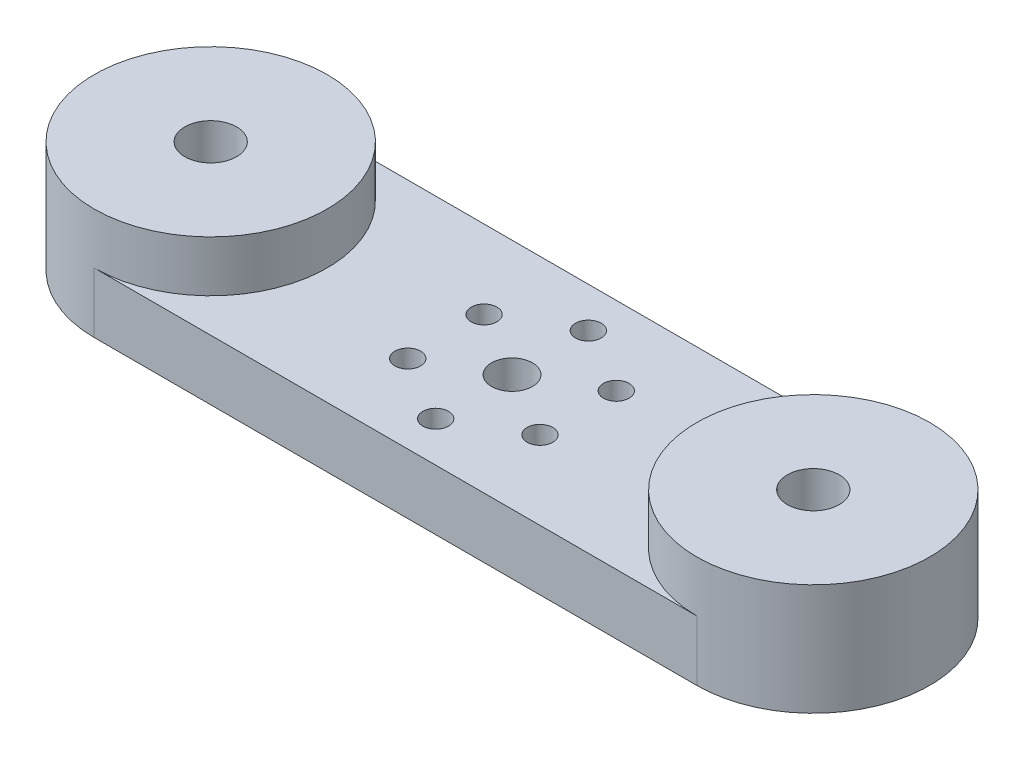
ISO-10303-21;
HEADER;
FILE_DESCRIPTION(('STEP AP214'),'2;1');
FILE_NAME('part.step','',(''),(''),'','','');
FILE_SCHEMA(('AUTOMOTIVE_DESIGN { 1 0 10303 214 1 1 1 1 }'));
ENDSEC;
DATA;
#1=APPLICATION_CONTEXT('core data for automotive mechanical design processes');
#2=APPLICATION_PROTOCOL_DEFINITION('international standard','automotive_design',2000,#1);
#3=PRODUCT_CONTEXT('',#1,'mechanical');
#4=PRODUCT('Part','Part','',(#3));
#5=PRODUCT_RELATED_PRODUCT_CATEGORY('part','',(#4));
#6=PRODUCT_DEFINITION_FORMATION('','',#4);
#7=PRODUCT_DEFINITION_CONTEXT('part definition',#1,'design');
#8=PRODUCT_DEFINITION('design','',#6,#7);
#9=PRODUCT_DEFINITION_SHAPE('','',#8);
#10=(LENGTH_UNIT() NAMED_UNIT(*) SI_UNIT(.MILLI.,.METRE.));
#11=(NAMED_UNIT(*) PLANE_ANGLE_UNIT() SI_UNIT($,.RADIAN.));
#12=(NAMED_UNIT(*) SI_UNIT($,.STERADIAN.) SOLID_ANGLE_UNIT());
#13=UNCERTAINTY_MEASURE_WITH_UNIT(LENGTH_MEASURE(1.E-05),#10,'distance_accuracy_value','');
#14=(GEOMETRIC_REPRESENTATION_CONTEXT(3) GLOBAL_UNCERTAINTY_ASSIGNED_CONTEXT((#13)) GLOBAL_UNIT_ASSIGNED_CONTEXT((#10,
#11,#12)) REPRESENTATION_CONTEXT('',''));
#15=CARTESIAN_POINT('',(0.,0.,0.));
#16=DIRECTION('',(0.,0.,1.));
#17=DIRECTION('',(1.,0.,0.));
#18=AXIS2_PLACEMENT_3D('',#15,#16,#17);
#19=CARTESIAN_POINT('',(-37.5,-7.5,0.));
#20=DIRECTION('',(0.,1.,0.));
#21=DIRECTION('',(0.,0.,1.));
#22=AXIS2_PLACEMENT_3D('',#19,#20,#21);
#23=CYLINDRICAL_SURFACE('',#22,14.5);
#24=DIRECTION('',(0.,1.,0.));
#25=VECTOR('',#24,1.);
#26=CARTESIAN_POINT('',(-37.5,-7.5,14.5));
#27=LINE('',#26,#25);
#28=CARTESIAN_POINT('',(-37.5,-7.5,14.5));
#29=VERTEX_POINT('',#28);
#30=CARTESIAN_POINT('',(-37.5,0.,14.5));
#31=VERTEX_POINT('',#30);
#32=EDGE_CURVE('E92',#29,#31,#27,.T.);
#33=ORIENTED_EDGE('',*,*,#32,.T.);
#34=CARTESIAN_POINT('',(-37.5,0.,0.));
#35=DIRECTION('',(0.,1.,0.));
#36=DIRECTION('',(0.,0.,1.));
#37=AXIS2_PLACEMENT_3D('',#34,#35,#36);
#38=CIRCLE('',#37,14.5);
#39=CARTESIAN_POINT('',(-37.5,0.,-14.5));
#40=VERTEX_POINT('',#39);
#41=EDGE_CURVE('E67',#31,#40,#38,.T.);
#42=ORIENTED_EDGE('',*,*,#41,.T.);
#43=DIRECTION('',(0.,1.,0.));
#44=VECTOR('',#43,1.);
#45=CARTESIAN_POINT('',(-37.5,-7.5,-14.5));
#46=LINE('',#45,#44);
#47=CARTESIAN_POINT('',(-37.5,-7.5,-14.5));
#48=VERTEX_POINT('',#47);
#49=EDGE_CURVE('E55',#48,#40,#46,.T.);
#50=ORIENTED_EDGE('',*,*,#49,.F.);
#51=CARTESIAN_POINT('',(-37.5,-7.5,0.));
#52=DIRECTION('',(0.,1.,0.));
#53=DIRECTION('',(0.,0.,1.));
#54=AXIS2_PLACEMENT_3D('',#51,#52,#53);
#55=CIRCLE('',#54,14.5);
#56=EDGE_CURVE('E104',#48,#29,#55,.T.);
#57=ORIENTED_EDGE('',*,*,#56,.T.);
#58=EDGE_LOOP('',(#33,#42,#50,#57));
#59=FACE_BOUND('',#58,.T.);
#60=CARTESIAN_POINT('',(-37.5,6.35,0.));
#61=DIRECTION('',(0.,1.,0.));
#62=DIRECTION('',(0.,0.,1.));
#63=AXIS2_PLACEMENT_3D('',#60,#61,#62);
#64=CIRCLE('',#63,14.5);
#65=CARTESIAN_POINT('',(-37.5,6.35,14.5));
#66=VERTEX_POINT('',#65);
#67=EDGE_CURVE('E135',#66,#66,#64,.T.);
#68=ORIENTED_EDGE('',*,*,#67,.F.);
#69=EDGE_LOOP('',(#68));
#70=FACE_BOUND('',#69,.T.);
#71=ADVANCED_FACE('F39',(#59,#70),#23,.T.);
#72=CARTESIAN_POINT('',(0.,-7.5,-14.5));
#73=DIRECTION('',(0.,0.,1.));
#74=DIRECTION('',(1.,0.,0.));
#75=AXIS2_PLACEMENT_3D('',#72,#73,#74);
#76=PLANE('',#75);
#77=DIRECTION('',(1.,0.,0.));
#78=VECTOR('',#77,1.);
#79=CARTESIAN_POINT('',(0.,0.,-14.5));
#80=LINE('',#79,#78);
#81=CARTESIAN_POINT('',(37.5,0.,-14.5));
#82=VERTEX_POINT('',#81);
#83=EDGE_CURVE('E115',#40,#82,#80,.T.);
#84=ORIENTED_EDGE('',*,*,#83,.T.);
#85=DIRECTION('',(0.,1.,0.));
#86=VECTOR('',#85,1.);
#87=CARTESIAN_POINT('',(37.5,-7.5,-14.5));
#88=LINE('',#87,#86);
#89=CARTESIAN_POINT('',(37.5,-7.5,-14.5));
#90=VERTEX_POINT('',#89);
#91=EDGE_CURVE('E91',#90,#82,#88,.T.);
#92=ORIENTED_EDGE('',*,*,#91,.F.);
#93=DIRECTION('',(1.,0.,0.));
#94=VECTOR('',#93,1.);
#95=CARTESIAN_POINT('',(0.,-7.5,-14.5));
#96=LINE('',#95,#94);
#97=EDGE_CURVE('E100',#48,#90,#96,.T.);
#98=ORIENTED_EDGE('',*,*,#97,.F.);
#99=ORIENTED_EDGE('',*,*,#49,.T.);
#100=EDGE_LOOP('',(#84,#92,#98,#99));
#101=FACE_BOUND('',#100,.T.);
#102=ADVANCED_FACE('F127',(#101),#76,.F.);
#103=CARTESIAN_POINT('',(37.5,-7.5,0.));
#104=DIRECTION('',(0.,1.,0.));
#105=DIRECTION('',(0.,0.,1.));
#106=AXIS2_PLACEMENT_3D('',#103,#104,#105);
#107=CYLINDRICAL_SURFACE('',#106,14.5);
#108=ORIENTED_EDGE('',*,*,#91,.T.);
#109=CARTESIAN_POINT('',(37.5,0.,0.));
#110=DIRECTION('',(0.,1.,0.));
#111=DIRECTION('',(0.,0.,1.));
#112=AXIS2_PLACEMENT_3D('',#109,#110,#111);
#113=CIRCLE('',#112,14.5);
#114=CARTESIAN_POINT('',(37.5,0.,14.5));
#115=VERTEX_POINT('',#114);
#116=EDGE_CURVE('E47',#82,#115,#113,.T.);
#117=ORIENTED_EDGE('',*,*,#116,.T.);
#118=DIRECTION('',(0.,1.,0.));
#119=VECTOR('',#118,1.);
#120=CARTESIAN_POINT('',(37.5,-7.5,14.5));
#121=LINE('',#120,#119);
#122=CARTESIAN_POINT('',(37.5,-7.5,14.5));
#123=VERTEX_POINT('',#122);
#124=EDGE_CURVE('E83',#123,#115,#121,.T.);
#125=ORIENTED_EDGE('',*,*,#124,.F.);
#126=CARTESIAN_POINT('',(37.5,-7.5,0.));
#127=DIRECTION('',(0.,1.,0.));
#128=DIRECTION('',(0.,0.,1.));
#129=AXIS2_PLACEMENT_3D('',#126,#127,#128);
#130=CIRCLE('',#129,14.5);
#131=EDGE_CURVE('E88',#123,#90,#130,.T.);
#132=ORIENTED_EDGE('',*,*,#131,.T.);
#133=EDGE_LOOP('',(#108,#117,#125,#132));
#134=FACE_BOUND('',#133,.T.);
#135=CARTESIAN_POINT('',(37.5,6.35,0.));
#136=DIRECTION('',(0.,1.,0.));
#137=DIRECTION('',(0.,0.,1.));
#138=AXIS2_PLACEMENT_3D('',#135,#136,#137);
#139=CIRCLE('',#138,14.5);
#140=CARTESIAN_POINT('',(37.5,6.35,14.5));
#141=VERTEX_POINT('',#140);
#142=EDGE_CURVE('E116',#141,#141,#139,.T.);
#143=ORIENTED_EDGE('',*,*,#142,.F.);
#144=EDGE_LOOP('',(#143));
#145=FACE_BOUND('',#144,.T.);
#146=ADVANCED_FACE('F86',(#134,#145),#107,.T.);
#147=CARTESIAN_POINT('',(0.,-7.5,14.5));
#148=DIRECTION('',(0.,0.,1.));
#149=DIRECTION('',(1.,0.,0.));
#150=AXIS2_PLACEMENT_3D('',#147,#148,#149);
#151=PLANE('',#150);
#152=DIRECTION('',(1.,0.,0.));
#153=VECTOR('',#152,1.);
#154=CARTESIAN_POINT('',(0.,0.,14.5));
#155=LINE('',#154,#153);
#156=EDGE_CURVE('E74',#31,#115,#155,.T.);
#157=ORIENTED_EDGE('',*,*,#156,.F.);
#158=ORIENTED_EDGE('',*,*,#32,.F.);
#159=DIRECTION('',(1.,0.,0.));
#160=VECTOR('',#159,1.);
#161=CARTESIAN_POINT('',(0.,-7.5,14.5));
#162=LINE('',#161,#160);
#163=EDGE_CURVE('E99',#29,#123,#162,.T.);
#164=ORIENTED_EDGE('',*,*,#163,.T.);
#165=ORIENTED_EDGE('',*,*,#124,.T.);
#166=EDGE_LOOP('',(#157,#158,#164,#165));
#167=FACE_BOUND('',#166,.T.);
#168=ADVANCED_FACE('F103',(#167),#151,.T.);
#169=CARTESIAN_POINT('',(0.,-7.5,0.));
#170=DIRECTION('',(0.,1.,0.));
#171=DIRECTION('',(0.,0.,1.));
#172=AXIS2_PLACEMENT_3D('',#169,#170,#171);
#173=CYLINDRICAL_SURFACE('',#172,2.55);
#174=CARTESIAN_POINT('',(0.,-7.5,0.));
#175=DIRECTION('',(0.,1.,0.));
#176=DIRECTION('',(0.,0.,1.));
#177=AXIS2_PLACEMENT_3D('',#174,#175,#176);
#178=CIRCLE('',#177,2.55);
#179=CARTESIAN_POINT('',(0.,-7.5,2.55));
#180=VERTEX_POINT('',#179);
#181=EDGE_CURVE('E111',#180,#180,#178,.T.);
#182=ORIENTED_EDGE('',*,*,#181,.F.);
#183=EDGE_LOOP('',(#182));
#184=FACE_BOUND('',#183,.T.);
#185=CARTESIAN_POINT('',(0.,0.,0.));
#186=DIRECTION('',(0.,1.,0.));
#187=DIRECTION('',(0.,0.,1.));
#188=AXIS2_PLACEMENT_3D('',#185,#186,#187);
#189=CIRCLE('',#188,2.55);
#190=CARTESIAN_POINT('',(0.,0.,2.55));
#191=VERTEX_POINT('',#190);
#192=EDGE_CURVE('E106',#191,#191,#189,.T.);
#193=ORIENTED_EDGE('',*,*,#192,.T.);
#194=EDGE_LOOP('',(#193));
#195=FACE_BOUND('',#194,.T.);
#196=ADVANCED_FACE('F224',(#184,#195),#173,.F.);
#197=CARTESIAN_POINT('',(0.,-7.5,0.));
#198=DIRECTION('',(0.,1.,0.));
#199=DIRECTION('',(0.,0.,1.));
#200=AXIS2_PLACEMENT_3D('',#197,#198,#199);
#201=PLANE('',#200);
#202=CARTESIAN_POINT('',(-8.22724133595217,-7.5,-4.74999999999999));
#203=DIRECTION('',(0.,1.,0.));
#204=DIRECTION('',(0.,0.,1.));
#205=AXIS2_PLACEMENT_3D('',#202,#203,#204);
#206=CIRCLE('',#205,1.6);
#207=CARTESIAN_POINT('',(-8.22724133595217,-7.5,-3.15));
#208=VERTEX_POINT('',#207);
#209=EDGE_CURVE('E173',#208,#208,#206,.T.);
#210=ORIENTED_EDGE('',*,*,#209,.T.);
#211=EDGE_LOOP('',(#210));
#212=FACE_BOUND('',#211,.T.);
#213=CARTESIAN_POINT('',(0.,-7.5,-9.5));
#214=DIRECTION('',(0.,1.,0.));
#215=DIRECTION('',(0.,0.,1.));
#216=AXIS2_PLACEMENT_3D('',#213,#214,#215);
#217=CIRCLE('',#216,1.6);
#218=CARTESIAN_POINT('',(0.,-7.5,-7.9));
#219=VERTEX_POINT('',#218);
#220=EDGE_CURVE('E167',#219,#219,#217,.T.);
#221=ORIENTED_EDGE('',*,*,#220,.T.);
#222=EDGE_LOOP('',(#221));
#223=FACE_BOUND('',#222,.T.);
#224=CARTESIAN_POINT('',(8.22724133595217,-7.5,-4.75));
#225=DIRECTION('',(0.,1.,0.));
#226=DIRECTION('',(0.,0.,1.));
#227=AXIS2_PLACEMENT_3D('',#224,#225,#226);
#228=CIRCLE('',#227,1.6);
#229=CARTESIAN_POINT('',(8.22724133595217,-7.5,-3.15000000000001));
#230=VERTEX_POINT('',#229);
#231=EDGE_CURVE('E161',#230,#230,#228,.T.);
#232=ORIENTED_EDGE('',*,*,#231,.T.);
#233=EDGE_LOOP('',(#232));
#234=FACE_BOUND('',#233,.T.);
#235=CARTESIAN_POINT('',(-8.22724133595217,-7.5,4.75));
#236=DIRECTION('',(0.,1.,0.));
#237=DIRECTION('',(0.,0.,1.));
#238=AXIS2_PLACEMENT_3D('',#235,#236,#237);
#239=CIRCLE('',#238,1.6);
#240=CARTESIAN_POINT('',(-8.22724133595217,-7.5,6.35));
#241=VERTEX_POINT('',#240);
#242=EDGE_CURVE('E155',#241,#241,#239,.T.);
#243=ORIENTED_EDGE('',*,*,#242,.T.);
#244=EDGE_LOOP('',(#243));
#245=FACE_BOUND('',#244,.T.);
#246=CARTESIAN_POINT('',(8.22724133595217,-7.5,4.75));
#247=DIRECTION('',(0.,1.,0.));
#248=DIRECTION('',(0.,0.,1.));
#249=AXIS2_PLACEMENT_3D('',#246,#247,#248);
#250=CIRCLE('',#249,1.6);
#251=CARTESIAN_POINT('',(8.22724133595217,-7.5,6.35));
#252=VERTEX_POINT('',#251);
#253=EDGE_CURVE('E149',#252,#252,#250,.T.);
#254=ORIENTED_EDGE('',*,*,#253,.T.);
#255=EDGE_LOOP('',(#254));
#256=FACE_BOUND('',#255,.T.);
#257=CARTESIAN_POINT('',(0.,-7.5,9.5));
#258=DIRECTION('',(0.,1.,0.));
#259=DIRECTION('',(0.,0.,1.));
#260=AXIS2_PLACEMENT_3D('',#257,#258,#259);
#261=CIRCLE('',#260,1.6);
#262=CARTESIAN_POINT('',(0.,-7.5,11.1));
#263=VERTEX_POINT('',#262);
#264=EDGE_CURVE('E124',#263,#263,#261,.T.);
#265=ORIENTED_EDGE('',*,*,#264,.T.);
#266=EDGE_LOOP('',(#265));
#267=FACE_BOUND('',#266,.T.);
#268=ORIENTED_EDGE('',*,*,#56,.F.);
#269=ORIENTED_EDGE('',*,*,#97,.T.);
#270=ORIENTED_EDGE('',*,*,#131,.F.);
#271=ORIENTED_EDGE('',*,*,#163,.F.);
#272=EDGE_LOOP('',(#268,#269,#270,#271));
#273=FACE_BOUND('',#272,.T.);
#274=ORIENTED_EDGE('',*,*,#181,.T.);
#275=EDGE_LOOP('',(#274));
#276=FACE_BOUND('',#275,.T.);
#277=ADVANCED_FACE('F97',(#212,#223,#234,#245,#256,#267,#273,#276),#201,.F.);
#278=CARTESIAN_POINT('',(0.,0.,0.));
#279=DIRECTION('',(0.,1.,0.));
#280=DIRECTION('',(0.,0.,1.));
#281=AXIS2_PLACEMENT_3D('',#278,#279,#280);
#282=PLANE('',#281);
#283=CARTESIAN_POINT('',(-8.22724133595217,0.,-4.74999999999999));
#284=DIRECTION('',(0.,1.,0.));
#285=DIRECTION('',(0.,0.,1.));
#286=AXIS2_PLACEMENT_3D('',#283,#284,#285);
#287=CIRCLE('',#286,1.6);
#288=CARTESIAN_POINT('',(-8.22724133595217,0.,-3.15));
#289=VERTEX_POINT('',#288);
#290=EDGE_CURVE('E176',#289,#289,#287,.T.);
#291=ORIENTED_EDGE('',*,*,#290,.F.);
#292=EDGE_LOOP('',(#291));
#293=FACE_BOUND('',#292,.T.);
#294=CARTESIAN_POINT('',(0.,0.,-9.5));
#295=DIRECTION('',(0.,1.,0.));
#296=DIRECTION('',(0.,0.,1.));
#297=AXIS2_PLACEMENT_3D('',#294,#295,#296);
#298=CIRCLE('',#297,1.6);
#299=CARTESIAN_POINT('',(0.,0.,-7.9));
#300=VERTEX_POINT('',#299);
#301=EDGE_CURVE('E170',#300,#300,#298,.T.);
#302=ORIENTED_EDGE('',*,*,#301,.F.);
#303=EDGE_LOOP('',(#302));
#304=FACE_BOUND('',#303,.T.);
#305=CARTESIAN_POINT('',(8.22724133595217,0.,-4.75));
#306=DIRECTION('',(0.,1.,0.));
#307=DIRECTION('',(0.,0.,1.));
#308=AXIS2_PLACEMENT_3D('',#305,#306,#307);
#309=CIRCLE('',#308,1.6);
#310=CARTESIAN_POINT('',(8.22724133595217,0.,-3.15));
#311=VERTEX_POINT('',#310);
#312=EDGE_CURVE('E164',#311,#311,#309,.T.);
#313=ORIENTED_EDGE('',*,*,#312,.F.);
#314=EDGE_LOOP('',(#313));
#315=FACE_BOUND('',#314,.T.);
#316=CARTESIAN_POINT('',(-8.22724133595217,0.,4.75));
#317=DIRECTION('',(0.,1.,0.));
#318=DIRECTION('',(0.,0.,1.));
#319=AXIS2_PLACEMENT_3D('',#316,#317,#318);
#320=CIRCLE('',#319,1.6);
#321=CARTESIAN_POINT('',(-8.22724133595217,0.,6.35));
#322=VERTEX_POINT('',#321);
#323=EDGE_CURVE('E158',#322,#322,#320,.T.);
#324=ORIENTED_EDGE('',*,*,#323,.F.);
#325=EDGE_LOOP('',(#324));
#326=FACE_BOUND('',#325,.T.);
#327=CARTESIAN_POINT('',(8.22724133595217,0.,4.75));
#328=DIRECTION('',(0.,1.,0.));
#329=DIRECTION('',(0.,0.,1.));
#330=AXIS2_PLACEMENT_3D('',#327,#328,#329);
#331=CIRCLE('',#330,1.6);
#332=CARTESIAN_POINT('',(8.22724133595217,0.,6.35));
#333=VERTEX_POINT('',#332);
#334=EDGE_CURVE('E152',#333,#333,#331,.T.);
#335=ORIENTED_EDGE('',*,*,#334,.F.);
#336=EDGE_LOOP('',(#335));
#337=FACE_BOUND('',#336,.T.);
#338=CARTESIAN_POINT('',(0.,0.,9.5));
#339=DIRECTION('',(0.,1.,0.));
#340=DIRECTION('',(0.,0.,1.));
#341=AXIS2_PLACEMENT_3D('',#338,#339,#340);
#342=CIRCLE('',#341,1.6);
#343=CARTESIAN_POINT('',(0.,0.,11.1));
#344=VERTEX_POINT('',#343);
#345=EDGE_CURVE('E146',#344,#344,#342,.T.);
#346=ORIENTED_EDGE('',*,*,#345,.F.);
#347=EDGE_LOOP('',(#346));
#348=FACE_BOUND('',#347,.T.);
#349=ORIENTED_EDGE('',*,*,#83,.F.);
#350=ORIENTED_EDGE('',*,*,#41,.F.);
#351=ORIENTED_EDGE('',*,*,#156,.T.);
#352=ORIENTED_EDGE('',*,*,#116,.F.);
#353=EDGE_LOOP('',(#349,#350,#351,#352));
#354=FACE_BOUND('',#353,.T.);
#355=ORIENTED_EDGE('',*,*,#192,.F.);
#356=EDGE_LOOP('',(#355));
#357=FACE_BOUND('',#356,.T.);
#358=ADVANCED_FACE('F128',(#293,#304,#315,#326,#337,#348,#354,#357),#282,.T.);
#359=CARTESIAN_POINT('',(37.5,6.35,0.));
#360=DIRECTION('',(0.,-1.,0.));
#361=DIRECTION('',(0.,0.,-1.));
#362=AXIS2_PLACEMENT_3D('',#359,#360,#361);
#363=CYLINDRICAL_SURFACE('',#362,3.225);
#364=CARTESIAN_POINT('',(37.5,6.35,0.));
#365=DIRECTION('',(0.,1.,0.));
#366=DIRECTION('',(0.,0.,1.));
#367=AXIS2_PLACEMENT_3D('',#364,#365,#366);
#368=CIRCLE('',#367,3.225);
#369=CARTESIAN_POINT('',(37.5,6.35,3.225));
#370=VERTEX_POINT('',#369);
#371=EDGE_CURVE('E134',#370,#370,#368,.T.);
#372=ORIENTED_EDGE('',*,*,#371,.T.);
#373=EDGE_LOOP('',(#372));
#374=FACE_BOUND('',#373,.T.);
#375=CARTESIAN_POINT('',(37.5,0.,0.));
#376=DIRECTION('',(0.,1.,0.));
#377=DIRECTION('',(0.,0.,1.));
#378=AXIS2_PLACEMENT_3D('',#375,#376,#377);
#379=CIRCLE('',#378,3.225);
#380=CARTESIAN_POINT('',(37.5,0.,3.225));
#381=VERTEX_POINT('',#380);
#382=EDGE_CURVE('E131',#381,#381,#379,.T.);
#383=ORIENTED_EDGE('',*,*,#382,.F.);
#384=EDGE_LOOP('',(#383));
#385=FACE_BOUND('',#384,.T.);
#386=ADVANCED_FACE('F184',(#374,#385),#363,.F.);
#387=CARTESIAN_POINT('',(0.,6.35,0.));
#388=DIRECTION('',(0.,1.,0.));
#389=DIRECTION('',(0.,0.,1.));
#390=AXIS2_PLACEMENT_3D('',#387,#388,#389);
#391=PLANE('',#390);
#392=ORIENTED_EDGE('',*,*,#371,.F.);
#393=EDGE_LOOP('',(#392));
#394=FACE_BOUND('',#393,.T.);
#395=ORIENTED_EDGE('',*,*,#142,.T.);
#396=EDGE_LOOP('',(#395));
#397=FACE_BOUND('',#396,.T.);
#398=ADVANCED_FACE('F244',(#394,#397),#391,.T.);
#399=ORIENTED_EDGE('',*,*,#382,.T.);
#400=EDGE_LOOP('',(#399));
#401=FACE_BOUND('',#400,.T.);
#402=ADVANCED_FACE('F187',(#401),#282,.T.);
#403=CARTESIAN_POINT('',(-37.5,6.35,0.));
#404=DIRECTION('',(0.,-1.,0.));
#405=DIRECTION('',(0.,0.,-1.));
#406=AXIS2_PLACEMENT_3D('',#403,#404,#405);
#407=CYLINDRICAL_SURFACE('',#406,3.225);
#408=CARTESIAN_POINT('',(-37.5,6.35,0.));
#409=DIRECTION('',(0.,1.,0.));
#410=DIRECTION('',(0.,0.,1.));
#411=AXIS2_PLACEMENT_3D('',#408,#409,#410);
#412=CIRCLE('',#411,3.225);
#413=CARTESIAN_POINT('',(-37.5,6.35,3.22500000000002));
#414=VERTEX_POINT('',#413);
#415=EDGE_CURVE('E123',#414,#414,#412,.T.);
#416=ORIENTED_EDGE('',*,*,#415,.T.);
#417=EDGE_LOOP('',(#416));
#418=FACE_BOUND('',#417,.T.);
#419=CARTESIAN_POINT('',(-37.5,0.,0.));
#420=DIRECTION('',(0.,1.,0.));
#421=DIRECTION('',(0.,0.,1.));
#422=AXIS2_PLACEMENT_3D('',#419,#420,#421);
#423=CIRCLE('',#422,3.225);
#424=CARTESIAN_POINT('',(-37.5,0.,3.22500000000002));
#425=VERTEX_POINT('',#424);
#426=EDGE_CURVE('E11',#425,#425,#423,.F.);
#427=ORIENTED_EDGE('',*,*,#426,.T.);
#428=EDGE_LOOP('',(#427));
#429=FACE_BOUND('',#428,.T.);
#430=ADVANCED_FACE('F249',(#418,#429),#407,.F.);
#431=CARTESIAN_POINT('',(0.,6.35,0.));
#432=DIRECTION('',(0.,1.,0.));
#433=DIRECTION('',(0.,0.,1.));
#434=AXIS2_PLACEMENT_3D('',#431,#432,#433);
#435=PLANE('',#434);
#436=ORIENTED_EDGE('',*,*,#415,.F.);
#437=EDGE_LOOP('',(#436));
#438=FACE_BOUND('',#437,.T.);
#439=ORIENTED_EDGE('',*,*,#67,.T.);
#440=EDGE_LOOP('',(#439));
#441=FACE_BOUND('',#440,.T.);
#442=ADVANCED_FACE('F210',(#438,#441),#435,.T.);
#443=ORIENTED_EDGE('',*,*,#426,.F.);
#444=EDGE_LOOP('',(#443));
#445=FACE_BOUND('',#444,.T.);
#446=ADVANCED_FACE('F186',(#445),#282,.T.);
#447=CARTESIAN_POINT('',(0.,0.,9.5));
#448=DIRECTION('',(0.,1.,0.));
#449=DIRECTION('',(0.,0.,1.));
#450=AXIS2_PLACEMENT_3D('',#447,#448,#449);
#451=CYLINDRICAL_SURFACE('',#450,1.6);
#452=ORIENTED_EDGE('',*,*,#264,.F.);
#453=EDGE_LOOP('',(#452));
#454=FACE_BOUND('',#453,.T.);
#455=ORIENTED_EDGE('',*,*,#345,.T.);
#456=EDGE_LOOP('',(#455));
#457=FACE_BOUND('',#456,.T.);
#458=ADVANCED_FACE('F198',(#454,#457),#451,.F.);
#459=CARTESIAN_POINT('',(8.22724133595217,0.,4.75));
#460=DIRECTION('',(0.,1.,0.));
#461=DIRECTION('',(0.,0.,1.));
#462=AXIS2_PLACEMENT_3D('',#459,#460,#461);
#463=CYLINDRICAL_SURFACE('',#462,1.6);
#464=ORIENTED_EDGE('',*,*,#253,.F.);
#465=EDGE_LOOP('',(#464));
#466=FACE_BOUND('',#465,.T.);
#467=ORIENTED_EDGE('',*,*,#334,.T.);
#468=EDGE_LOOP('',(#467));
#469=FACE_BOUND('',#468,.T.);
#470=ADVANCED_FACE('F200',(#466,#469),#463,.F.);
#471=CARTESIAN_POINT('',(-8.22724133595217,0.,4.75));
#472=DIRECTION('',(0.,1.,0.));
#473=DIRECTION('',(0.,0.,1.));
#474=AXIS2_PLACEMENT_3D('',#471,#472,#473);
#475=CYLINDRICAL_SURFACE('',#474,1.6);
#476=ORIENTED_EDGE('',*,*,#242,.F.);
#477=EDGE_LOOP('',(#476));
#478=FACE_BOUND('',#477,.T.);
#479=ORIENTED_EDGE('',*,*,#323,.T.);
#480=EDGE_LOOP('',(#479));
#481=FACE_BOUND('',#480,.T.);
#482=ADVANCED_FACE('F207',(#478,#481),#475,.F.);
#483=CARTESIAN_POINT('',(8.22724133595217,0.,-4.75));
#484=DIRECTION('',(0.,1.,0.));
#485=DIRECTION('',(0.,0.,1.));
#486=AXIS2_PLACEMENT_3D('',#483,#484,#485);
#487=CYLINDRICAL_SURFACE('',#486,1.6);
#488=ORIENTED_EDGE('',*,*,#231,.F.);
#489=EDGE_LOOP('',(#488));
#490=FACE_BOUND('',#489,.T.);
#491=ORIENTED_EDGE('',*,*,#312,.T.);
#492=EDGE_LOOP('',(#491));
#493=FACE_BOUND('',#492,.T.);
#494=ADVANCED_FACE('F303',(#490,#493),#487,.F.);
#495=CARTESIAN_POINT('',(0.,0.,-9.5));
#496=DIRECTION('',(0.,1.,0.));
#497=DIRECTION('',(0.,0.,1.));
#498=AXIS2_PLACEMENT_3D('',#495,#496,#497);
#499=CYLINDRICAL_SURFACE('',#498,1.6);
#500=ORIENTED_EDGE('',*,*,#220,.F.);
#501=EDGE_LOOP('',(#500));
#502=FACE_BOUND('',#501,.T.);
#503=ORIENTED_EDGE('',*,*,#301,.T.);
#504=EDGE_LOOP('',(#503));
#505=FACE_BOUND('',#504,.T.);
#506=ADVANCED_FACE('F313',(#502,#505),#499,.F.);
#507=CARTESIAN_POINT('',(-8.22724133595217,0.,-4.74999999999999));
#508=DIRECTION('',(0.,1.,0.));
#509=DIRECTION('',(0.,0.,1.));
#510=AXIS2_PLACEMENT_3D('',#507,#508,#509);
#511=CYLINDRICAL_SURFACE('',#510,1.6);
#512=ORIENTED_EDGE('',*,*,#209,.F.);
#513=EDGE_LOOP('',(#512));
#514=FACE_BOUND('',#513,.T.);
#515=ORIENTED_EDGE('',*,*,#290,.T.);
#516=EDGE_LOOP('',(#515));
#517=FACE_BOUND('',#516,.T.);
#518=ADVANCED_FACE('F180',(#514,#517),#511,.F.);
#519=CLOSED_SHELL('',(#71,#102,#146,#168,#196,#277,#358,#386,#398,#402,#430,#442,#446,#458,#470,
#482,#494,#506,#518));
#520=MANIFOLD_SOLID_BREP('B2',#519);
#521=ADVANCED_BREP_SHAPE_REPRESENTATION('',(#18,#520),#14);
#522=SHAPE_DEFINITION_REPRESENTATION(#9,#521);
ENDSEC;
END-ISO-10303-21;
